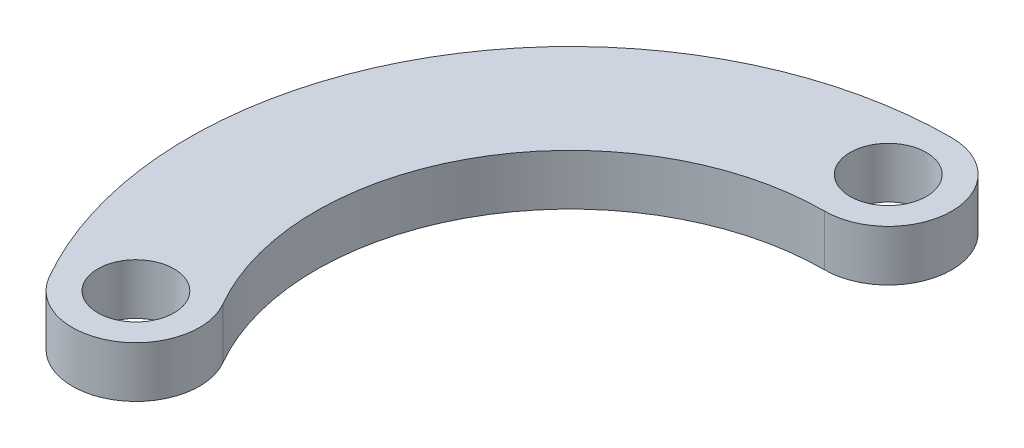
ISO-10303-21;
HEADER;
FILE_DESCRIPTION(('STEP AP214'),'2;1');
FILE_NAME('part.step','',(''),(''),'','','');
FILE_SCHEMA(('AUTOMOTIVE_DESIGN { 1 0 10303 214 1 1 1 1 }'));
ENDSEC;
DATA;
#1=APPLICATION_CONTEXT('core data for automotive mechanical design processes');
#2=APPLICATION_PROTOCOL_DEFINITION('international standard','automotive_design',2000,#1);
#3=PRODUCT_CONTEXT('',#1,'mechanical');
#4=PRODUCT('Part','Part','',(#3));
#5=PRODUCT_RELATED_PRODUCT_CATEGORY('part','',(#4));
#6=PRODUCT_DEFINITION_FORMATION('','',#4);
#7=PRODUCT_DEFINITION_CONTEXT('part definition',#1,'design');
#8=PRODUCT_DEFINITION('design','',#6,#7);
#9=PRODUCT_DEFINITION_SHAPE('','',#8);
#10=(LENGTH_UNIT() NAMED_UNIT(*) SI_UNIT(.MILLI.,.METRE.));
#11=(NAMED_UNIT(*) PLANE_ANGLE_UNIT() SI_UNIT($,.RADIAN.));
#12=(NAMED_UNIT(*) SI_UNIT($,.STERADIAN.) SOLID_ANGLE_UNIT());
#13=UNCERTAINTY_MEASURE_WITH_UNIT(LENGTH_MEASURE(1.E-05),#10,'distance_accuracy_value','');
#14=(GEOMETRIC_REPRESENTATION_CONTEXT(3) GLOBAL_UNCERTAINTY_ASSIGNED_CONTEXT((#13)) GLOBAL_UNIT_ASSIGNED_CONTEXT((#10,
#11,#12)) REPRESENTATION_CONTEXT('',''));
#15=CARTESIAN_POINT('',(0.,0.,0.));
#16=DIRECTION('',(0.,0.,1.));
#17=DIRECTION('',(1.,0.,0.));
#18=AXIS2_PLACEMENT_3D('',#15,#16,#17);
#19=CARTESIAN_POINT('',(0.,2.,0.));
#20=DIRECTION('',(0.,-1.,0.));
#21=DIRECTION('',(0.,0.,-1.));
#22=AXIS2_PLACEMENT_3D('',#19,#20,#21);
#23=CYLINDRICAL_SURFACE('',#22,15.);
#24=CARTESIAN_POINT('',(0.,2.,0.));
#25=DIRECTION('',(0.,1.,0.));
#26=DIRECTION('',(0.,0.,1.));
#27=AXIS2_PLACEMENT_3D('',#24,#25,#26);
#28=CIRCLE('',#27,15.);
#29=CARTESIAN_POINT('',(0.,2.,-15.));
#30=VERTEX_POINT('',#29);
#31=CARTESIAN_POINT('',(-12.9903810567664,2.,7.50000000000034));
#32=VERTEX_POINT('',#31);
#33=EDGE_CURVE('E12',#30,#32,#28,.T.);
#34=ORIENTED_EDGE('',*,*,#33,.F.);
#35=DIRECTION('',(0.,1.,0.));
#36=VECTOR('',#35,1.);
#37=CARTESIAN_POINT('',(0.,0.,-15.));
#38=LINE('',#37,#36);
#39=CARTESIAN_POINT('',(0.,0.,-15.));
#40=VERTEX_POINT('',#39);
#41=EDGE_CURVE('E107',#40,#30,#38,.T.);
#42=ORIENTED_EDGE('',*,*,#41,.F.);
#43=CARTESIAN_POINT('',(0.,0.,0.));
#44=DIRECTION('',(0.,1.,0.));
#45=DIRECTION('',(0.,0.,1.));
#46=AXIS2_PLACEMENT_3D('',#43,#44,#45);
#47=CIRCLE('',#46,15.);
#48=CARTESIAN_POINT('',(-12.9903810567664,0.,7.50000000000034));
#49=VERTEX_POINT('',#48);
#50=EDGE_CURVE('E72',#40,#49,#47,.T.);
#51=ORIENTED_EDGE('',*,*,#50,.T.);
#52=DIRECTION('',(0.,1.,0.));
#53=VECTOR('',#52,1.);
#54=CARTESIAN_POINT('',(-12.9903810567664,0.,7.50000000000034));
#55=LINE('',#54,#53);
#56=EDGE_CURVE('E118',#49,#32,#55,.T.);
#57=ORIENTED_EDGE('',*,*,#56,.T.);
#58=EDGE_LOOP('',(#34,#42,#51,#57));
#59=FACE_BOUND('',#58,.T.);
#60=ADVANCED_FACE('F69',(#59),#23,.T.);
#61=CARTESIAN_POINT('',(0.,2.,0.));
#62=DIRECTION('',(0.,1.,0.));
#63=DIRECTION('',(0.,0.,1.));
#64=AXIS2_PLACEMENT_3D('',#61,#62,#63);
#65=PLANE('',#64);
#66=ORIENTED_EDGE('',*,*,#33,.T.);
#67=CARTESIAN_POINT('',(-10.8253175473052,2.,6.25000000000019));
#68=DIRECTION('',(0.,1.,0.));
#69=DIRECTION('',(0.,0.,1.));
#70=AXIS2_PLACEMENT_3D('',#67,#68,#69);
#71=CIRCLE('',#70,2.5);
#72=CARTESIAN_POINT('',(-8.66025403784426,2.,5.00000000000023));
#73=VERTEX_POINT('',#72);
#74=EDGE_CURVE('E154',#32,#73,#71,.T.);
#75=ORIENTED_EDGE('',*,*,#74,.T.);
#76=CARTESIAN_POINT('',(0.,2.,0.));
#77=DIRECTION('',(0.,1.,0.));
#78=DIRECTION('',(0.,0.,1.));
#79=AXIS2_PLACEMENT_3D('',#76,#77,#78);
#80=CIRCLE('',#79,10.);
#81=CARTESIAN_POINT('',(0.,2.,-10.));
#82=VERTEX_POINT('',#81);
#83=EDGE_CURVE('E83',#82,#73,#80,.T.);
#84=ORIENTED_EDGE('',*,*,#83,.F.);
#85=CARTESIAN_POINT('',(0.,2.,-12.5));
#86=DIRECTION('',(0.,1.,0.));
#87=DIRECTION('',(0.,0.,1.));
#88=AXIS2_PLACEMENT_3D('',#85,#86,#87);
#89=CIRCLE('',#88,2.5);
#90=EDGE_CURVE('E111',#82,#30,#89,.T.);
#91=ORIENTED_EDGE('',*,*,#90,.T.);
#92=EDGE_LOOP('',(#66,#75,#84,#91));
#93=FACE_BOUND('',#92,.T.);
#94=CARTESIAN_POINT('',(0.,2.,-12.5));
#95=DIRECTION('',(0.,1.,0.));
#96=DIRECTION('',(0.,0.,1.));
#97=AXIS2_PLACEMENT_3D('',#94,#95,#96);
#98=CIRCLE('',#97,1.5);
#99=CARTESIAN_POINT('',(0.,2.,-11.));
#100=VERTEX_POINT('',#99);
#101=EDGE_CURVE('E143',#100,#100,#98,.T.);
#102=ORIENTED_EDGE('',*,*,#101,.F.);
#103=EDGE_LOOP('',(#102));
#104=FACE_BOUND('',#103,.T.);
#105=CARTESIAN_POINT('',(-10.8253175473052,2.,6.25000000000019));
#106=DIRECTION('',(0.,1.,0.));
#107=DIRECTION('',(0.,0.,1.));
#108=AXIS2_PLACEMENT_3D('',#105,#106,#107);
#109=CIRCLE('',#108,1.5);
#110=CARTESIAN_POINT('',(-10.8253175473052,2.,7.75000000000019));
#111=VERTEX_POINT('',#110);
#112=EDGE_CURVE('E137',#111,#111,#109,.T.);
#113=ORIENTED_EDGE('',*,*,#112,.F.);
#114=EDGE_LOOP('',(#113));
#115=FACE_BOUND('',#114,.T.);
#116=ADVANCED_FACE('F121',(#93,#104,#115),#65,.T.);
#117=CARTESIAN_POINT('',(0.,0.,0.));
#118=DIRECTION('',(0.,1.,0.));
#119=DIRECTION('',(0.,0.,1.));
#120=AXIS2_PLACEMENT_3D('',#117,#118,#119);
#121=PLANE('',#120);
#122=CARTESIAN_POINT('',(0.,0.,0.));
#123=DIRECTION('',(0.,1.,0.));
#124=DIRECTION('',(0.,0.,1.));
#125=AXIS2_PLACEMENT_3D('',#122,#123,#124);
#126=CIRCLE('',#125,10.);
#127=CARTESIAN_POINT('',(0.,0.,-10.));
#128=VERTEX_POINT('',#127);
#129=CARTESIAN_POINT('',(-8.66025403784426,0.,5.00000000000023));
#130=VERTEX_POINT('',#129);
#131=EDGE_CURVE('E146',#128,#130,#126,.T.);
#132=ORIENTED_EDGE('',*,*,#131,.T.);
#133=CARTESIAN_POINT('',(-10.8253175473052,0.,6.25000000000019));
#134=DIRECTION('',(0.,1.,0.));
#135=DIRECTION('',(0.,0.,1.));
#136=AXIS2_PLACEMENT_3D('',#133,#134,#135);
#137=CIRCLE('',#136,2.5);
#138=EDGE_CURVE('E125',#49,#130,#137,.T.);
#139=ORIENTED_EDGE('',*,*,#138,.F.);
#140=ORIENTED_EDGE('',*,*,#50,.F.);
#141=CARTESIAN_POINT('',(0.,0.,-12.5));
#142=DIRECTION('',(0.,1.,0.));
#143=DIRECTION('',(0.,0.,1.));
#144=AXIS2_PLACEMENT_3D('',#141,#142,#143);
#145=CIRCLE('',#144,2.5);
#146=EDGE_CURVE('E113',#128,#40,#145,.T.);
#147=ORIENTED_EDGE('',*,*,#146,.F.);
#148=EDGE_LOOP('',(#132,#139,#140,#147));
#149=FACE_BOUND('',#148,.T.);
#150=CARTESIAN_POINT('',(0.,0.,-12.5));
#151=DIRECTION('',(0.,1.,0.));
#152=DIRECTION('',(0.,0.,1.));
#153=AXIS2_PLACEMENT_3D('',#150,#151,#152);
#154=CIRCLE('',#153,1.5);
#155=CARTESIAN_POINT('',(0.,0.,-11.));
#156=VERTEX_POINT('',#155);
#157=EDGE_CURVE('E140',#156,#156,#154,.T.);
#158=ORIENTED_EDGE('',*,*,#157,.T.);
#159=EDGE_LOOP('',(#158));
#160=FACE_BOUND('',#159,.T.);
#161=CARTESIAN_POINT('',(-10.8253175473052,0.,6.25000000000019));
#162=DIRECTION('',(0.,1.,0.));
#163=DIRECTION('',(0.,0.,1.));
#164=AXIS2_PLACEMENT_3D('',#161,#162,#163);
#165=CIRCLE('',#164,1.5);
#166=CARTESIAN_POINT('',(-10.8253175473052,0.,7.75000000000019));
#167=VERTEX_POINT('',#166);
#168=EDGE_CURVE('E136',#167,#167,#165,.T.);
#169=ORIENTED_EDGE('',*,*,#168,.T.);
#170=EDGE_LOOP('',(#169));
#171=FACE_BOUND('',#170,.T.);
#172=ADVANCED_FACE('F151',(#149,#160,#171),#121,.F.);
#173=CARTESIAN_POINT('',(0.,2.,0.));
#174=DIRECTION('',(0.,-1.,0.));
#175=DIRECTION('',(0.,0.,-1.));
#176=AXIS2_PLACEMENT_3D('',#173,#174,#175);
#177=CYLINDRICAL_SURFACE('',#176,10.);
#178=DIRECTION('',(0.,-1.,0.));
#179=VECTOR('',#178,1.);
#180=CARTESIAN_POINT('',(-8.66025403784426,2.,5.00000000000023));
#181=LINE('',#180,#179);
#182=EDGE_CURVE('E87',#130,#73,#181,.F.);
#183=ORIENTED_EDGE('',*,*,#182,.F.);
#184=ORIENTED_EDGE('',*,*,#131,.F.);
#185=DIRECTION('',(0.,1.,0.));
#186=VECTOR('',#185,1.);
#187=CARTESIAN_POINT('',(0.,0.,-10.));
#188=LINE('',#187,#186);
#189=EDGE_CURVE('E117',#128,#82,#188,.T.);
#190=ORIENTED_EDGE('',*,*,#189,.T.);
#191=ORIENTED_EDGE('',*,*,#83,.T.);
#192=EDGE_LOOP('',(#183,#184,#190,#191));
#193=FACE_BOUND('',#192,.T.);
#194=ADVANCED_FACE('F157',(#193),#177,.F.);
#195=CARTESIAN_POINT('',(0.,2.,-12.5));
#196=DIRECTION('',(0.,-1.,0.));
#197=DIRECTION('',(0.,0.,-1.));
#198=AXIS2_PLACEMENT_3D('',#195,#196,#197);
#199=CYLINDRICAL_SURFACE('',#198,1.5);
#200=ORIENTED_EDGE('',*,*,#101,.T.);
#201=EDGE_LOOP('',(#200));
#202=FACE_BOUND('',#201,.T.);
#203=ORIENTED_EDGE('',*,*,#157,.F.);
#204=EDGE_LOOP('',(#203));
#205=FACE_BOUND('',#204,.T.);
#206=ADVANCED_FACE('F159',(#202,#205),#199,.F.);
#207=CARTESIAN_POINT('',(-10.8253175473052,2.,6.25000000000019));
#208=DIRECTION('',(0.,-1.,0.));
#209=DIRECTION('',(0.,0.,-1.));
#210=AXIS2_PLACEMENT_3D('',#207,#208,#209);
#211=CYLINDRICAL_SURFACE('',#210,1.5);
#212=ORIENTED_EDGE('',*,*,#112,.T.);
#213=EDGE_LOOP('',(#212));
#214=FACE_BOUND('',#213,.T.);
#215=ORIENTED_EDGE('',*,*,#168,.F.);
#216=EDGE_LOOP('',(#215));
#217=FACE_BOUND('',#216,.T.);
#218=ADVANCED_FACE('F166',(#214,#217),#211,.F.);
#219=CARTESIAN_POINT('',(0.,0.,-12.5));
#220=DIRECTION('',(0.,1.,0.));
#221=DIRECTION('',(0.,0.,1.));
#222=AXIS2_PLACEMENT_3D('',#219,#220,#221);
#223=CYLINDRICAL_SURFACE('',#222,2.5);
#224=ORIENTED_EDGE('',*,*,#41,.T.);
#225=ORIENTED_EDGE('',*,*,#90,.F.);
#226=ORIENTED_EDGE('',*,*,#189,.F.);
#227=ORIENTED_EDGE('',*,*,#146,.T.);
#228=EDGE_LOOP('',(#224,#225,#226,#227));
#229=FACE_BOUND('',#228,.T.);
#230=ADVANCED_FACE('F109',(#229),#223,.T.);
#231=CARTESIAN_POINT('',(-10.8253175473052,0.,6.25000000000019));
#232=DIRECTION('',(0.,1.,0.));
#233=DIRECTION('',(0.,0.,1.));
#234=AXIS2_PLACEMENT_3D('',#231,#232,#233);
#235=CYLINDRICAL_SURFACE('',#234,2.5);
#236=ORIENTED_EDGE('',*,*,#56,.F.);
#237=ORIENTED_EDGE('',*,*,#138,.T.);
#238=ORIENTED_EDGE('',*,*,#182,.T.);
#239=ORIENTED_EDGE('',*,*,#74,.F.);
#240=EDGE_LOOP('',(#236,#237,#238,#239));
#241=FACE_BOUND('',#240,.T.);
#242=ADVANCED_FACE('F153',(#241),#235,.T.);
#243=CLOSED_SHELL('',(#60,#116,#172,#194,#206,#218,#230,#242));
#244=MANIFOLD_SOLID_BREP('B2',#243);
#245=ADVANCED_BREP_SHAPE_REPRESENTATION('',(#18,#244),#14);
#246=SHAPE_DEFINITION_REPRESENTATION(#9,#245);
ENDSEC;
END-ISO-10303-21;
